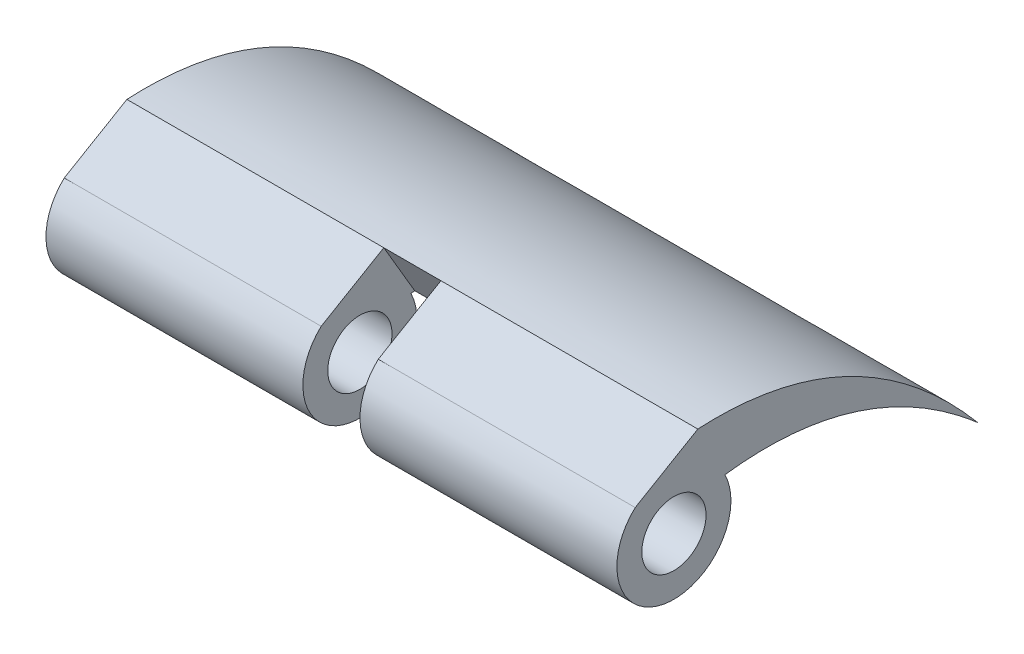
ISO-10303-21;
HEADER;
FILE_DESCRIPTION(('STEP AP214'),'2;1');
FILE_NAME('part.step','',(''),(''),'','','');
FILE_SCHEMA(('AUTOMOTIVE_DESIGN { 1 0 10303 214 1 1 1 1 }'));
ENDSEC;
DATA;
#1=APPLICATION_CONTEXT('core data for automotive mechanical design processes');
#2=APPLICATION_PROTOCOL_DEFINITION('international standard','automotive_design',2000,#1);
#3=PRODUCT_CONTEXT('',#1,'mechanical');
#4=PRODUCT('Part','Part','',(#3));
#5=PRODUCT_RELATED_PRODUCT_CATEGORY('part','',(#4));
#6=PRODUCT_DEFINITION_FORMATION('','',#4);
#7=PRODUCT_DEFINITION_CONTEXT('part definition',#1,'design');
#8=PRODUCT_DEFINITION('design','',#6,#7);
#9=PRODUCT_DEFINITION_SHAPE('','',#8);
#10=(LENGTH_UNIT() NAMED_UNIT(*) SI_UNIT(.MILLI.,.METRE.));
#11=(NAMED_UNIT(*) PLANE_ANGLE_UNIT() SI_UNIT($,.RADIAN.));
#12=(NAMED_UNIT(*) SI_UNIT($,.STERADIAN.) SOLID_ANGLE_UNIT());
#13=UNCERTAINTY_MEASURE_WITH_UNIT(LENGTH_MEASURE(1.E-05),#10,'distance_accuracy_value','');
#14=(GEOMETRIC_REPRESENTATION_CONTEXT(3) GLOBAL_UNCERTAINTY_ASSIGNED_CONTEXT((#13)) GLOBAL_UNIT_ASSIGNED_CONTEXT((#10,
#11,#12)) REPRESENTATION_CONTEXT('',''));
#15=CARTESIAN_POINT('',(0.,0.,0.));
#16=DIRECTION('',(0.,0.,1.));
#17=DIRECTION('',(1.,0.,0.));
#18=AXIS2_PLACEMENT_3D('',#15,#16,#17);
#19=CARTESIAN_POINT('',(16.,1.17336668932794,1.08450108554183));
#20=DIRECTION('',(0.,-0.862685147667814,-0.505741372633644));
#21=DIRECTION('',(0.,0.505741372633644,-0.862685147667814));
#22=AXIS2_PLACEMENT_3D('',#19,#20,#21);
#23=PLANE('',#22);
#24=DIRECTION('',(-1.,0.,0.));
#25=VECTOR('',#24,1.);
#26=CARTESIAN_POINT('',(16.,1.17336668932794,1.08450108554183));
#27=LINE('',#26,#25);
#28=CARTESIAN_POINT('',(7.2,1.17336668932795,1.08450108554182));
#29=VERTEX_POINT('',#28);
#30=CARTESIAN_POINT('',(0.,1.17336668932794,1.08450108554183));
#31=VERTEX_POINT('',#30);
#32=EDGE_CURVE('E257',#29,#31,#27,.T.);
#33=ORIENTED_EDGE('',*,*,#32,.F.);
#34=DIRECTION('',(0.,-0.505741372633644,0.862685147667814));
#35=VECTOR('',#34,1.);
#36=CARTESIAN_POINT('',(7.2,2.2019162729791,-0.669981536346676));
#37=LINE('',#36,#35);
#38=CARTESIAN_POINT('',(7.2,2.2019162729791,-0.669981536346676));
#39=VERTEX_POINT('',#38);
#40=EDGE_CURVE('E143',#39,#29,#37,.T.);
#41=ORIENTED_EDGE('',*,*,#40,.F.);
#42=DIRECTION('',(-1.,0.,0.));
#43=VECTOR('',#42,1.);
#44=CARTESIAN_POINT('',(16.,2.2019162729791,-0.669981536346675));
#45=LINE('',#44,#43);
#46=CARTESIAN_POINT('',(0.,2.2019162729791,-0.669981536346675));
#47=VERTEX_POINT('',#46);
#48=EDGE_CURVE('E149',#39,#47,#45,.T.);
#49=ORIENTED_EDGE('',*,*,#48,.T.);
#50=DIRECTION('',(0.,-0.505741372633644,0.862685147667814));
#51=VECTOR('',#50,1.);
#52=CARTESIAN_POINT('',(0.,1.17336668932794,1.08450108554183));
#53=LINE('',#52,#51);
#54=EDGE_CURVE('E259',#47,#31,#53,.T.);
#55=ORIENTED_EDGE('',*,*,#54,.T.);
#56=EDGE_LOOP('',(#33,#41,#49,#55));
#57=FACE_BOUND('',#56,.T.);
#58=ADVANCED_FACE('F43',(#57),#23,.F.);
#59=CARTESIAN_POINT('',(16.,0.,0.));
#60=DIRECTION('',(-1.,0.,0.));
#61=DIRECTION('',(0.,0.,1.));
#62=AXIS2_PLACEMENT_3D('',#59,#60,#61);
#63=CYLINDRICAL_SURFACE('',#62,1.59778972088502);
#64=DIRECTION('',(-1.,0.,0.));
#65=VECTOR('',#64,1.);
#66=CARTESIAN_POINT('',(16.,0.712979376243712,-1.42989244393309));
#67=LINE('',#66,#65);
#68=CARTESIAN_POINT('',(7.2,0.712979376243712,-1.42989244393309));
#69=VERTEX_POINT('',#68);
#70=CARTESIAN_POINT('',(0.,0.712979376243712,-1.42989244393309));
#71=VERTEX_POINT('',#70);
#72=EDGE_CURVE('E93',#69,#71,#67,.T.);
#73=ORIENTED_EDGE('',*,*,#72,.F.);
#74=CARTESIAN_POINT('',(7.2,0.,0.));
#75=DIRECTION('',(-1.,0.,0.));
#76=DIRECTION('',(0.,0.,1.));
#77=AXIS2_PLACEMENT_3D('',#74,#75,#76);
#78=CIRCLE('',#77,1.59778972088502);
#79=EDGE_CURVE('E175',#69,#29,#78,.T.);
#80=ORIENTED_EDGE('',*,*,#79,.T.);
#81=ORIENTED_EDGE('',*,*,#32,.T.);
#82=CARTESIAN_POINT('',(0.,0.,0.));
#83=DIRECTION('',(1.,0.,0.));
#84=DIRECTION('',(0.,0.,-1.));
#85=AXIS2_PLACEMENT_3D('',#82,#83,#84);
#86=CIRCLE('',#85,1.59778972088502);
#87=EDGE_CURVE('E206',#31,#71,#86,.T.);
#88=ORIENTED_EDGE('',*,*,#87,.T.);
#89=EDGE_LOOP('',(#73,#80,#81,#88));
#90=FACE_BOUND('',#89,.T.);
#91=ADVANCED_FACE('F228',(#90),#63,.T.);
#92=CARTESIAN_POINT('',(16.,0.,0.));
#93=DIRECTION('',(-1.,0.,0.));
#94=DIRECTION('',(0.,0.,1.));
#95=AXIS2_PLACEMENT_3D('',#92,#93,#94);
#96=CYLINDRICAL_SURFACE('',#95,0.9);
#97=CARTESIAN_POINT('',(7.2,0.,0.));
#98=DIRECTION('',(-1.,0.,0.));
#99=DIRECTION('',(0.,0.,1.));
#100=AXIS2_PLACEMENT_3D('',#97,#98,#99);
#101=CIRCLE('',#100,0.9);
#102=CARTESIAN_POINT('',(7.2,0.,0.9));
#103=VERTEX_POINT('',#102);
#104=EDGE_CURVE('E48',#103,#103,#101,.T.);
#105=ORIENTED_EDGE('',*,*,#104,.F.);
#106=EDGE_LOOP('',(#105));
#107=FACE_BOUND('',#106,.T.);
#108=CARTESIAN_POINT('',(0.,0.,0.));
#109=DIRECTION('',(1.,0.,0.));
#110=DIRECTION('',(0.,0.,-1.));
#111=AXIS2_PLACEMENT_3D('',#108,#109,#110);
#112=CIRCLE('',#111,0.9);
#113=CARTESIAN_POINT('',(0.,0.,-0.9));
#114=VERTEX_POINT('',#113);
#115=EDGE_CURVE('E192',#114,#114,#112,.T.);
#116=ORIENTED_EDGE('',*,*,#115,.F.);
#117=EDGE_LOOP('',(#116));
#118=FACE_BOUND('',#117,.T.);
#119=ADVANCED_FACE('F236',(#107,#118),#96,.F.);
#120=CARTESIAN_POINT('',(16.,0.391458497975649,-5.15231069055825));
#121=DIRECTION('',(1.,0.,0.));
#122=DIRECTION('',(0.,0.,-1.));
#123=AXIS2_PLACEMENT_3D('',#120,#121,#122);
#124=PLANE('',#123);
#125=CARTESIAN_POINT('',(16.,0.712979376243712,-1.42989244393309));
#126=CARTESIAN_POINT('',(16.,1.21169784824269,-5.32880907512792));
#127=CARTESIAN_POINT('',(16.,-1.57054108082649,-8.52173216804406));
#128=B_SPLINE_CURVE_WITH_KNOTS('',2,(#125,#126,#127),.UNSPECIFIED.,.F.,.F.,(3,3),(0.,1.),.UNSPECIFIED.);
#129=CARTESIAN_POINT('',(16.,0.712979376243712,-1.42989244393309));
#130=VERTEX_POINT('',#129);
#131=CARTESIAN_POINT('',(16.,-1.57054108082649,-8.52173216804406));
#132=VERTEX_POINT('',#131);
#133=EDGE_CURVE('E200',#130,#132,#128,.T.);
#134=ORIENTED_EDGE('',*,*,#133,.T.);
#135=CARTESIAN_POINT('',(16.,-1.57054108082649,-8.52173216804406));
#136=CARTESIAN_POINT('',(16.,2.44155471871516,-5.14201200292099));
#137=CARTESIAN_POINT('',(16.,2.2019162729791,-0.669981536346675));
#138=B_SPLINE_CURVE_WITH_KNOTS('',2,(#135,#136,#137),.UNSPECIFIED.,.F.,.F.,(3,3),(0.,1.),.UNSPECIFIED.);
#139=CARTESIAN_POINT('',(16.,2.2019162729791,-0.669981536346675));
#140=VERTEX_POINT('',#139);
#141=EDGE_CURVE('E100',#132,#140,#138,.T.);
#142=ORIENTED_EDGE('',*,*,#141,.T.);
#143=DIRECTION('',(0.,-0.505741372633644,0.862685147667814));
#144=VECTOR('',#143,1.);
#145=CARTESIAN_POINT('',(16.,1.17336668932794,1.08450108554183));
#146=LINE('',#145,#144);
#147=CARTESIAN_POINT('',(16.,1.17336668932794,1.08450108554183));
#148=VERTEX_POINT('',#147);
#149=EDGE_CURVE('E153',#140,#148,#146,.T.);
#150=ORIENTED_EDGE('',*,*,#149,.T.);
#151=CARTESIAN_POINT('',(16.,0.,0.));
#152=DIRECTION('',(1.,0.,0.));
#153=DIRECTION('',(0.,0.,-1.));
#154=AXIS2_PLACEMENT_3D('',#151,#152,#153);
#155=CIRCLE('',#154,1.59778972088502);
#156=EDGE_CURVE('E71',#148,#130,#155,.T.);
#157=ORIENTED_EDGE('',*,*,#156,.T.);
#158=EDGE_LOOP('',(#134,#142,#150,#157));
#159=FACE_BOUND('',#158,.T.);
#160=CARTESIAN_POINT('',(16.,0.,0.));
#161=DIRECTION('',(1.,0.,0.));
#162=DIRECTION('',(0.,0.,-1.));
#163=AXIS2_PLACEMENT_3D('',#160,#161,#162);
#164=CIRCLE('',#163,0.9);
#165=CARTESIAN_POINT('',(16.,0.,-0.9));
#166=VERTEX_POINT('',#165);
#167=EDGE_CURVE('E193',#166,#166,#164,.T.);
#168=ORIENTED_EDGE('',*,*,#167,.F.);
#169=EDGE_LOOP('',(#168));
#170=FACE_BOUND('',#169,.T.);
#171=ADVANCED_FACE('F232',(#159,#170),#124,.T.);
#172=CARTESIAN_POINT('',(0.,0.391458497975649,-5.15231069055825));
#173=DIRECTION('',(1.,0.,0.));
#174=DIRECTION('',(0.,0.,-1.));
#175=AXIS2_PLACEMENT_3D('',#172,#173,#174);
#176=PLANE('',#175);
#177=CARTESIAN_POINT('',(0.,0.712979376243712,-1.42989244393309));
#178=CARTESIAN_POINT('',(0.,1.21169784824269,-5.32880907512792));
#179=CARTESIAN_POINT('',(0.,-1.57054108082649,-8.52173216804406));
#180=B_SPLINE_CURVE_WITH_KNOTS('',2,(#177,#178,#179),.UNSPECIFIED.,.F.,.F.,(3,3),(0.,1.),.UNSPECIFIED.);
#181=CARTESIAN_POINT('',(0.,-1.57054108082649,-8.52173216804406));
#182=VERTEX_POINT('',#181);
#183=EDGE_CURVE('E197',#71,#182,#180,.T.);
#184=ORIENTED_EDGE('',*,*,#183,.F.);
#185=ORIENTED_EDGE('',*,*,#87,.F.);
#186=ORIENTED_EDGE('',*,*,#54,.F.);
#187=CARTESIAN_POINT('',(0.,-1.57054108082649,-8.52173216804406));
#188=CARTESIAN_POINT('',(0.,2.44155471871516,-5.14201200292099));
#189=CARTESIAN_POINT('',(0.,2.2019162729791,-0.669981536346675));
#190=B_SPLINE_CURVE_WITH_KNOTS('',2,(#187,#188,#189),.UNSPECIFIED.,.F.,.F.,(3,3),(0.,1.),.UNSPECIFIED.);
#191=EDGE_CURVE('E273',#182,#47,#190,.T.);
#192=ORIENTED_EDGE('',*,*,#191,.F.);
#193=EDGE_LOOP('',(#184,#185,#186,#192));
#194=FACE_BOUND('',#193,.T.);
#195=ORIENTED_EDGE('',*,*,#115,.T.);
#196=EDGE_LOOP('',(#195));
#197=FACE_BOUND('',#196,.T.);
#198=ADVANCED_FACE('F229',(#194,#197),#176,.F.);
#199=DIRECTION('',(-1.,0.,0.));
#200=VECTOR('',#199,1.);
#201=SURFACE_OF_LINEAR_EXTRUSION('',#128,#200);
#202=DIRECTION('',(-1.,0.,0.));
#203=VECTOR('',#202,1.);
#204=CARTESIAN_POINT('',(16.,0.725877367693589,-1.53529600714501));
#205=LINE('',#204,#203);
#206=CARTESIAN_POINT('',(8.8,0.725877363994072,-1.53529600931382));
#207=VERTEX_POINT('',#206);
#208=CARTESIAN_POINT('',(7.2,0.725877367693591,-1.53529600714501));
#209=VERTEX_POINT('',#208);
#210=EDGE_CURVE('E130',#207,#209,#205,.T.);
#211=ORIENTED_EDGE('',*,*,#210,.T.);
#212=CARTESIAN_POINT('',(7.2,0.712979376243712,-1.42989244393309));
#213=CARTESIAN_POINT('',(7.2,1.21169784824269,-5.32880907512792));
#214=CARTESIAN_POINT('',(7.2,-1.57054108082649,-8.52173216804406));
#215=B_SPLINE_CURVE_WITH_KNOTS('',2,(#212,#213,#214),.UNSPECIFIED.,.F.,.F.,(3,3),(0.,1.),.UNSPECIFIED.);
#216=EDGE_CURVE('E182',#209,#69,#215,.F.);
#217=ORIENTED_EDGE('',*,*,#216,.T.);
#218=ORIENTED_EDGE('',*,*,#72,.T.);
#219=ORIENTED_EDGE('',*,*,#183,.T.);
#220=DIRECTION('',(-1.,0.,0.));
#221=VECTOR('',#220,1.);
#222=CARTESIAN_POINT('',(16.,-1.57054108082649,-8.52173216804406));
#223=LINE('',#222,#221);
#224=EDGE_CURVE('E11',#132,#182,#223,.T.);
#225=ORIENTED_EDGE('',*,*,#224,.F.);
#226=ORIENTED_EDGE('',*,*,#133,.F.);
#227=CARTESIAN_POINT('',(8.8,0.712979376243712,-1.42989244393309));
#228=VERTEX_POINT('',#227);
#229=EDGE_CURVE('E262',#130,#228,#67,.T.);
#230=ORIENTED_EDGE('',*,*,#229,.T.);
#231=CARTESIAN_POINT('',(8.8,0.712979376243712,-1.42989244393309));
#232=CARTESIAN_POINT('',(8.8,1.21169784824269,-5.32880907512792));
#233=CARTESIAN_POINT('',(8.8,-1.57054108082649,-8.52173216804406));
#234=B_SPLINE_CURVE_WITH_KNOTS('',2,(#231,#232,#233),.UNSPECIFIED.,.F.,.F.,(3,3),(0.,1.),.UNSPECIFIED.);
#235=EDGE_CURVE('E62',#228,#207,#234,.T.);
#236=ORIENTED_EDGE('',*,*,#235,.T.);
#237=EDGE_LOOP('',(#211,#217,#218,#219,#225,#226,#230,#236));
#238=FACE_BOUND('',#237,.T.);
#239=ADVANCED_FACE('F45',(#238),#201,.F.);
#240=DIRECTION('',(-1.,0.,0.));
#241=VECTOR('',#240,1.);
#242=SURFACE_OF_LINEAR_EXTRUSION('',#138,#241);
#243=ORIENTED_EDGE('',*,*,#191,.T.);
#244=ORIENTED_EDGE('',*,*,#48,.F.);
#245=DIRECTION('',(-1.,0.,0.));
#246=VECTOR('',#245,1.);
#247=CARTESIAN_POINT('',(7.2,2.2019162729791,-0.669981536346676));
#248=LINE('',#247,#246);
#249=CARTESIAN_POINT('',(8.8,2.2019162729791,-0.669981536346676));
#250=VERTEX_POINT('',#249);
#251=EDGE_CURVE('E127',#250,#39,#248,.T.);
#252=ORIENTED_EDGE('',*,*,#251,.F.);
#253=EDGE_CURVE('E54',#140,#250,#45,.T.);
#254=ORIENTED_EDGE('',*,*,#253,.F.);
#255=ORIENTED_EDGE('',*,*,#141,.F.);
#256=ORIENTED_EDGE('',*,*,#224,.T.);
#257=EDGE_LOOP('',(#243,#244,#252,#254,#255,#256));
#258=FACE_BOUND('',#257,.T.);
#259=ADVANCED_FACE('F147',(#258),#242,.F.);
#260=ORIENTED_EDGE('',*,*,#253,.T.);
#261=DIRECTION('',(0.,0.505741372633644,-0.862685147667814));
#262=VECTOR('',#261,1.);
#263=CARTESIAN_POINT('',(8.8,2.2019162729791,-0.669981536346676));
#264=LINE('',#263,#262);
#265=CARTESIAN_POINT('',(8.8,1.17336668932795,1.08450108554182));
#266=VERTEX_POINT('',#265);
#267=EDGE_CURVE('E135',#266,#250,#264,.T.);
#268=ORIENTED_EDGE('',*,*,#267,.F.);
#269=EDGE_CURVE('E157',#148,#266,#27,.T.);
#270=ORIENTED_EDGE('',*,*,#269,.F.);
#271=ORIENTED_EDGE('',*,*,#149,.F.);
#272=EDGE_LOOP('',(#260,#268,#270,#271));
#273=FACE_BOUND('',#272,.T.);
#274=ADVANCED_FACE('F152',(#273),#23,.F.);
#275=ORIENTED_EDGE('',*,*,#269,.T.);
#276=CARTESIAN_POINT('',(8.8,0.,0.));
#277=DIRECTION('',(1.,0.,0.));
#278=DIRECTION('',(0.,0.,-1.));
#279=AXIS2_PLACEMENT_3D('',#276,#277,#278);
#280=CIRCLE('',#279,1.59778972088502);
#281=EDGE_CURVE('E137',#266,#228,#280,.T.);
#282=ORIENTED_EDGE('',*,*,#281,.T.);
#283=ORIENTED_EDGE('',*,*,#229,.F.);
#284=ORIENTED_EDGE('',*,*,#156,.F.);
#285=EDGE_LOOP('',(#275,#282,#283,#284));
#286=FACE_BOUND('',#285,.T.);
#287=ADVANCED_FACE('F223',(#286),#63,.T.);
#288=CARTESIAN_POINT('',(8.8,0.,0.));
#289=DIRECTION('',(1.,0.,0.));
#290=DIRECTION('',(0.,0.,-1.));
#291=AXIS2_PLACEMENT_3D('',#288,#289,#290);
#292=CIRCLE('',#291,0.9);
#293=CARTESIAN_POINT('',(8.8,0.,-0.9));
#294=VERTEX_POINT('',#293);
#295=EDGE_CURVE('E160',#294,#294,#292,.T.);
#296=ORIENTED_EDGE('',*,*,#295,.F.);
#297=EDGE_LOOP('',(#296));
#298=FACE_BOUND('',#297,.T.);
#299=ORIENTED_EDGE('',*,*,#167,.T.);
#300=EDGE_LOOP('',(#299));
#301=FACE_BOUND('',#300,.T.);
#302=ADVANCED_FACE('F226',(#298,#301),#96,.F.);
#303=CARTESIAN_POINT('',(7.2,-6.42493520369904,-5.72739526268312));
#304=DIRECTION('',(0.,0.505741372633644,-0.862685147667814));
#305=DIRECTION('',(0.,0.862685147667814,0.505741372633644));
#306=AXIS2_PLACEMENT_3D('',#303,#304,#305);
#307=PLANE('',#306);
#308=DIRECTION('',(0.,0.862685147667814,0.505741372633644));
#309=VECTOR('',#308,1.);
#310=CARTESIAN_POINT('',(8.8,-6.42493520369904,-5.72739526268312));
#311=LINE('',#310,#309);
#312=EDGE_CURVE('E122',#207,#250,#311,.T.);
#313=ORIENTED_EDGE('',*,*,#312,.T.);
#314=ORIENTED_EDGE('',*,*,#251,.T.);
#315=DIRECTION('',(0.,0.862685147667814,0.505741372633644));
#316=VECTOR('',#315,1.);
#317=CARTESIAN_POINT('',(7.2,-6.42493520369904,-5.72739526268312));
#318=LINE('',#317,#316);
#319=EDGE_CURVE('E132',#209,#39,#318,.T.);
#320=ORIENTED_EDGE('',*,*,#319,.F.);
#321=ORIENTED_EDGE('',*,*,#210,.F.);
#322=EDGE_LOOP('',(#313,#314,#320,#321));
#323=FACE_BOUND('',#322,.T.);
#324=ADVANCED_FACE('F124',(#323),#307,.F.);
#325=CARTESIAN_POINT('',(7.2,-6.42493520369904,-5.72739526268312));
#326=DIRECTION('',(-1.,0.,0.));
#327=DIRECTION('',(0.,0.,1.));
#328=AXIS2_PLACEMENT_3D('',#325,#326,#327);
#329=PLANE('',#328);
#330=ORIENTED_EDGE('',*,*,#104,.T.);
#331=EDGE_LOOP('',(#330));
#332=FACE_BOUND('',#331,.T.);
#333=ORIENTED_EDGE('',*,*,#319,.T.);
#334=ORIENTED_EDGE('',*,*,#40,.T.);
#335=ORIENTED_EDGE('',*,*,#79,.F.);
#336=ORIENTED_EDGE('',*,*,#216,.F.);
#337=EDGE_LOOP('',(#333,#334,#335,#336));
#338=FACE_BOUND('',#337,.T.);
#339=ADVANCED_FACE('F240',(#332,#338),#329,.F.);
#340=CARTESIAN_POINT('',(8.8,-6.42493520369904,-5.72739526268312));
#341=DIRECTION('',(1.,0.,0.));
#342=DIRECTION('',(0.,0.,-1.));
#343=AXIS2_PLACEMENT_3D('',#340,#341,#342);
#344=PLANE('',#343);
#345=ORIENTED_EDGE('',*,*,#295,.T.);
#346=EDGE_LOOP('',(#345));
#347=FACE_BOUND('',#346,.T.);
#348=ORIENTED_EDGE('',*,*,#281,.F.);
#349=ORIENTED_EDGE('',*,*,#267,.T.);
#350=ORIENTED_EDGE('',*,*,#312,.F.);
#351=ORIENTED_EDGE('',*,*,#235,.F.);
#352=EDGE_LOOP('',(#348,#349,#350,#351));
#353=FACE_BOUND('',#352,.T.);
#354=ADVANCED_FACE('F136',(#347,#353),#344,.F.);
#355=CLOSED_SHELL('',(#58,#91,#119,#171,#198,#239,#259,#274,#287,#302,#324,#339,#354));
#356=MANIFOLD_SOLID_BREP('B2',#355);
#357=ADVANCED_BREP_SHAPE_REPRESENTATION('',(#18,#356),#14);
#358=SHAPE_DEFINITION_REPRESENTATION(#9,#357);
ENDSEC;
END-ISO-10303-21;
